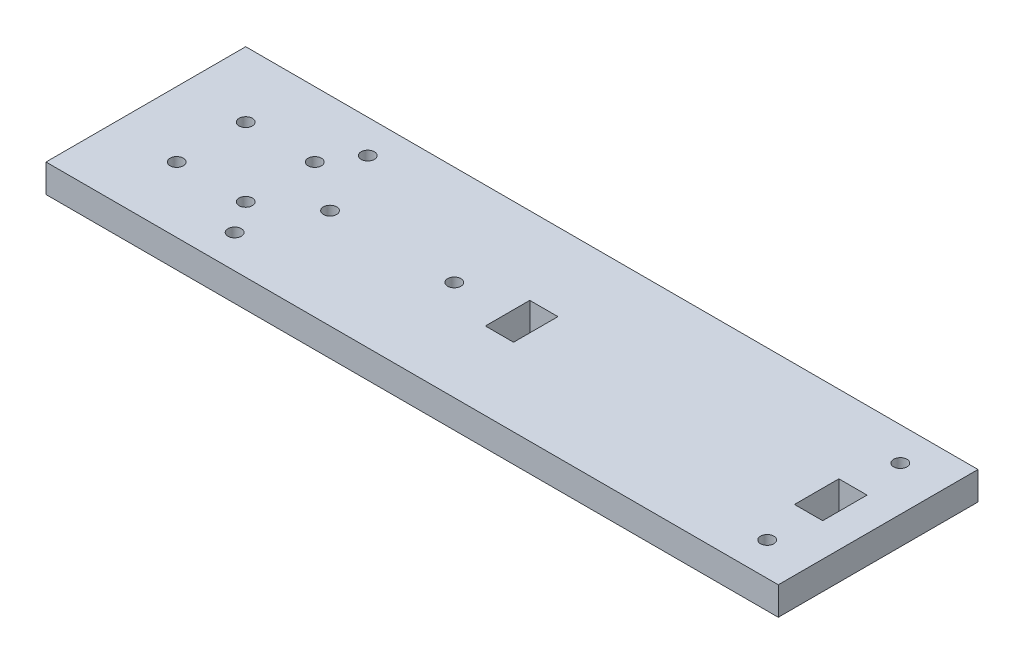
ISO-10303-21;
HEADER;
FILE_DESCRIPTION(('STEP AP214'),'2;1');
FILE_NAME('part.step','',(''),(''),'','','');
FILE_SCHEMA(('AUTOMOTIVE_DESIGN { 1 0 10303 214 1 1 1 1 }'));
ENDSEC;
DATA;
#1=APPLICATION_CONTEXT('core data for automotive mechanical design processes');
#2=APPLICATION_PROTOCOL_DEFINITION('international standard','automotive_design',2000,#1);
#3=PRODUCT_CONTEXT('',#1,'mechanical');
#4=PRODUCT('Part','Part','',(#3));
#5=PRODUCT_RELATED_PRODUCT_CATEGORY('part','',(#4));
#6=PRODUCT_DEFINITION_FORMATION('','',#4);
#7=PRODUCT_DEFINITION_CONTEXT('part definition',#1,'design');
#8=PRODUCT_DEFINITION('design','',#6,#7);
#9=PRODUCT_DEFINITION_SHAPE('','',#8);
#10=(LENGTH_UNIT() NAMED_UNIT(*) SI_UNIT(.MILLI.,.METRE.));
#11=(NAMED_UNIT(*) PLANE_ANGLE_UNIT() SI_UNIT($,.RADIAN.));
#12=(NAMED_UNIT(*) SI_UNIT($,.STERADIAN.) SOLID_ANGLE_UNIT());
#13=UNCERTAINTY_MEASURE_WITH_UNIT(LENGTH_MEASURE(1.E-05),#10,'distance_accuracy_value','');
#14=(GEOMETRIC_REPRESENTATION_CONTEXT(3) GLOBAL_UNCERTAINTY_ASSIGNED_CONTEXT((#13)) GLOBAL_UNIT_ASSIGNED_CONTEXT((#10,
#11,#12)) REPRESENTATION_CONTEXT('',''));
#15=CARTESIAN_POINT('',(0.,0.,0.));
#16=DIRECTION('',(0.,0.,1.));
#17=DIRECTION('',(1.,0.,0.));
#18=AXIS2_PLACEMENT_3D('',#15,#16,#17);
#19=CARTESIAN_POINT('',(81.5,6.35,0.));
#20=DIRECTION('',(1.,0.,0.));
#21=DIRECTION('',(0.,0.,-1.));
#22=AXIS2_PLACEMENT_3D('',#19,#20,#21);
#23=PLANE('',#22);
#24=DIRECTION('',(0.,0.,1.));
#25=VECTOR('',#24,1.);
#26=CARTESIAN_POINT('',(81.5,0.,0.));
#27=LINE('',#26,#25);
#28=CARTESIAN_POINT('',(81.5,0.,-27.5));
#29=VERTEX_POINT('',#28);
#30=CARTESIAN_POINT('',(81.5,0.,-17.5));
#31=VERTEX_POINT('',#30);
#32=EDGE_CURVE('E214',#29,#31,#27,.T.);
#33=ORIENTED_EDGE('',*,*,#32,.F.);
#34=DIRECTION('',(0.,-1.,0.));
#35=VECTOR('',#34,1.);
#36=CARTESIAN_POINT('',(81.5,6.35,-27.5));
#37=LINE('',#36,#35);
#38=CARTESIAN_POINT('',(81.5,6.35,-27.5));
#39=VERTEX_POINT('',#38);
#40=EDGE_CURVE('E11',#39,#29,#37,.T.);
#41=ORIENTED_EDGE('',*,*,#40,.F.);
#42=DIRECTION('',(0.,0.,1.));
#43=VECTOR('',#42,1.);
#44=CARTESIAN_POINT('',(81.5,6.35,0.));
#45=LINE('',#44,#43);
#46=CARTESIAN_POINT('',(81.5,6.35,-17.5));
#47=VERTEX_POINT('',#46);
#48=EDGE_CURVE('E152',#39,#47,#45,.T.);
#49=ORIENTED_EDGE('',*,*,#48,.T.);
#50=DIRECTION('',(0.,-1.,0.));
#51=VECTOR('',#50,1.);
#52=CARTESIAN_POINT('',(81.5,6.35,-17.5));
#53=LINE('',#52,#51);
#54=EDGE_CURVE('E101',#47,#31,#53,.T.);
#55=ORIENTED_EDGE('',*,*,#54,.T.);
#56=EDGE_LOOP('',(#33,#41,#49,#55));
#57=FACE_BOUND('',#56,.T.);
#58=ADVANCED_FACE('F35',(#57),#23,.T.);
#59=CARTESIAN_POINT('',(0.,6.35,-27.5));
#60=DIRECTION('',(0.,0.,1.));
#61=DIRECTION('',(1.,0.,0.));
#62=AXIS2_PLACEMENT_3D('',#59,#60,#61);
#63=PLANE('',#62);
#64=DIRECTION('',(-1.,0.,0.));
#65=VECTOR('',#64,1.);
#66=CARTESIAN_POINT('',(0.,0.,-27.5));
#67=LINE('',#66,#65);
#68=CARTESIAN_POINT('',(87.85,0.,-27.5));
#69=VERTEX_POINT('',#68);
#70=EDGE_CURVE('E142',#69,#29,#67,.T.);
#71=ORIENTED_EDGE('',*,*,#70,.F.);
#72=DIRECTION('',(0.,-1.,0.));
#73=VECTOR('',#72,1.);
#74=CARTESIAN_POINT('',(87.85,6.35,-27.5));
#75=LINE('',#74,#73);
#76=CARTESIAN_POINT('',(87.85,6.35,-27.5));
#77=VERTEX_POINT('',#76);
#78=EDGE_CURVE('E45',#77,#69,#75,.T.);
#79=ORIENTED_EDGE('',*,*,#78,.F.);
#80=DIRECTION('',(-1.,0.,0.));
#81=VECTOR('',#80,1.);
#82=CARTESIAN_POINT('',(0.,6.35,-27.5));
#83=LINE('',#82,#81);
#84=EDGE_CURVE('E140',#77,#39,#83,.T.);
#85=ORIENTED_EDGE('',*,*,#84,.T.);
#86=ORIENTED_EDGE('',*,*,#40,.T.);
#87=EDGE_LOOP('',(#71,#79,#85,#86));
#88=FACE_BOUND('',#87,.T.);
#89=ADVANCED_FACE('F138',(#88),#63,.T.);
#90=CARTESIAN_POINT('',(87.85,6.35,0.));
#91=DIRECTION('',(1.,0.,0.));
#92=DIRECTION('',(0.,0.,-1.));
#93=AXIS2_PLACEMENT_3D('',#90,#91,#92);
#94=PLANE('',#93);
#95=DIRECTION('',(0.,0.,1.));
#96=VECTOR('',#95,1.);
#97=CARTESIAN_POINT('',(87.85,0.,0.));
#98=LINE('',#97,#96);
#99=CARTESIAN_POINT('',(87.85,0.,-17.5));
#100=VERTEX_POINT('',#99);
#101=EDGE_CURVE('E217',#69,#100,#98,.T.);
#102=ORIENTED_EDGE('',*,*,#101,.T.);
#103=DIRECTION('',(0.,-1.,0.));
#104=VECTOR('',#103,1.);
#105=CARTESIAN_POINT('',(87.85,6.35,-17.5));
#106=LINE('',#105,#104);
#107=CARTESIAN_POINT('',(87.85,6.35,-17.5));
#108=VERTEX_POINT('',#107);
#109=EDGE_CURVE('E145',#108,#100,#106,.T.);
#110=ORIENTED_EDGE('',*,*,#109,.F.);
#111=DIRECTION('',(0.,0.,1.));
#112=VECTOR('',#111,1.);
#113=CARTESIAN_POINT('',(87.85,6.35,0.));
#114=LINE('',#113,#112);
#115=EDGE_CURVE('E148',#77,#108,#114,.T.);
#116=ORIENTED_EDGE('',*,*,#115,.F.);
#117=ORIENTED_EDGE('',*,*,#78,.T.);
#118=EDGE_LOOP('',(#102,#110,#116,#117));
#119=FACE_BOUND('',#118,.T.);
#120=ADVANCED_FACE('F149',(#119),#94,.F.);
#121=CARTESIAN_POINT('',(0.,6.35,-27.5000000000001));
#122=DIRECTION('',(0.,0.,-1.));
#123=DIRECTION('',(-1.,0.,0.));
#124=AXIS2_PLACEMENT_3D('',#121,#122,#123);
#125=PLANE('',#124);
#126=DIRECTION('',(1.,0.,0.));
#127=VECTOR('',#126,1.);
#128=CARTESIAN_POINT('',(0.,0.,-27.5000000000001));
#129=LINE('',#128,#127);
#130=CARTESIAN_POINT('',(151.15,0.,-27.5));
#131=VERTEX_POINT('',#130);
#132=CARTESIAN_POINT('',(157.5,0.,-27.5));
#133=VERTEX_POINT('',#132);
#134=EDGE_CURVE('E202',#131,#133,#129,.T.);
#135=ORIENTED_EDGE('',*,*,#134,.T.);
#136=DIRECTION('',(0.,-1.,0.));
#137=VECTOR('',#136,1.);
#138=CARTESIAN_POINT('',(157.5,6.35,-27.5));
#139=LINE('',#138,#137);
#140=CARTESIAN_POINT('',(157.5,6.35,-27.5));
#141=VERTEX_POINT('',#140);
#142=EDGE_CURVE('E222',#141,#133,#139,.T.);
#143=ORIENTED_EDGE('',*,*,#142,.F.);
#144=DIRECTION('',(1.,0.,0.));
#145=VECTOR('',#144,1.);
#146=CARTESIAN_POINT('',(0.,6.35,-27.5000000000001));
#147=LINE('',#146,#145);
#148=CARTESIAN_POINT('',(151.15,6.35,-27.5));
#149=VERTEX_POINT('',#148);
#150=EDGE_CURVE('E555',#149,#141,#147,.T.);
#151=ORIENTED_EDGE('',*,*,#150,.F.);
#152=DIRECTION('',(0.,-1.,0.));
#153=VECTOR('',#152,1.);
#154=CARTESIAN_POINT('',(151.15,6.35,-27.5));
#155=LINE('',#154,#153);
#156=EDGE_CURVE('E224',#149,#131,#155,.T.);
#157=ORIENTED_EDGE('',*,*,#156,.T.);
#158=EDGE_LOOP('',(#135,#143,#151,#157));
#159=FACE_BOUND('',#158,.T.);
#160=ADVANCED_FACE('F282',(#159),#125,.F.);
#161=CARTESIAN_POINT('',(157.5,6.35,0.));
#162=DIRECTION('',(1.,0.,0.));
#163=DIRECTION('',(0.,0.,-1.));
#164=AXIS2_PLACEMENT_3D('',#161,#162,#163);
#165=PLANE('',#164);
#166=DIRECTION('',(0.,0.,1.));
#167=VECTOR('',#166,1.);
#168=CARTESIAN_POINT('',(157.5,0.,0.));
#169=LINE('',#168,#167);
#170=CARTESIAN_POINT('',(157.5,0.,-17.5));
#171=VERTEX_POINT('',#170);
#172=EDGE_CURVE('E205',#133,#171,#169,.T.);
#173=ORIENTED_EDGE('',*,*,#172,.T.);
#174=DIRECTION('',(0.,-1.,0.));
#175=VECTOR('',#174,1.);
#176=CARTESIAN_POINT('',(157.5,6.35,-17.5));
#177=LINE('',#176,#175);
#178=CARTESIAN_POINT('',(157.5,6.35,-17.5));
#179=VERTEX_POINT('',#178);
#180=EDGE_CURVE('E228',#179,#171,#177,.T.);
#181=ORIENTED_EDGE('',*,*,#180,.F.);
#182=DIRECTION('',(0.,0.,1.));
#183=VECTOR('',#182,1.);
#184=CARTESIAN_POINT('',(157.5,6.35,0.));
#185=LINE('',#184,#183);
#186=EDGE_CURVE('E558',#141,#179,#185,.T.);
#187=ORIENTED_EDGE('',*,*,#186,.F.);
#188=ORIENTED_EDGE('',*,*,#142,.T.);
#189=EDGE_LOOP('',(#173,#181,#187,#188));
#190=FACE_BOUND('',#189,.T.);
#191=ADVANCED_FACE('F278',(#190),#165,.F.);
#192=CARTESIAN_POINT('',(0.,6.35,-17.5000000000001));
#193=DIRECTION('',(0.,0.,-1.));
#194=DIRECTION('',(-1.,0.,0.));
#195=AXIS2_PLACEMENT_3D('',#192,#193,#194);
#196=PLANE('',#195);
#197=DIRECTION('',(1.,0.,0.));
#198=VECTOR('',#197,1.);
#199=CARTESIAN_POINT('',(0.,0.,-17.5000000000001));
#200=LINE('',#199,#198);
#201=CARTESIAN_POINT('',(151.15,0.,-17.5));
#202=VERTEX_POINT('',#201);
#203=EDGE_CURVE('E208',#202,#171,#200,.T.);
#204=ORIENTED_EDGE('',*,*,#203,.F.);
#205=DIRECTION('',(0.,-1.,0.));
#206=VECTOR('',#205,1.);
#207=CARTESIAN_POINT('',(151.15,6.35,-17.5));
#208=LINE('',#207,#206);
#209=CARTESIAN_POINT('',(151.15,6.35,-17.5));
#210=VERTEX_POINT('',#209);
#211=EDGE_CURVE('E226',#210,#202,#208,.T.);
#212=ORIENTED_EDGE('',*,*,#211,.F.);
#213=DIRECTION('',(1.,0.,0.));
#214=VECTOR('',#213,1.);
#215=CARTESIAN_POINT('',(0.,6.35,-17.5000000000001));
#216=LINE('',#215,#214);
#217=EDGE_CURVE('E564',#210,#179,#216,.T.);
#218=ORIENTED_EDGE('',*,*,#217,.T.);
#219=ORIENTED_EDGE('',*,*,#180,.T.);
#220=EDGE_LOOP('',(#204,#212,#218,#219));
#221=FACE_BOUND('',#220,.T.);
#222=ADVANCED_FACE('F275',(#221),#196,.T.);
#223=CARTESIAN_POINT('',(0.,6.35,0.));
#224=DIRECTION('',(0.,0.,-1.));
#225=DIRECTION('',(-1.,0.,0.));
#226=AXIS2_PLACEMENT_3D('',#223,#224,#225);
#227=PLANE('',#226);
#228=DIRECTION('',(1.,0.,0.));
#229=VECTOR('',#228,1.);
#230=CARTESIAN_POINT('',(0.,0.,0.));
#231=LINE('',#230,#229);
#232=CARTESIAN_POINT('',(0.,0.,0.));
#233=VERTEX_POINT('',#232);
#234=CARTESIAN_POINT('',(165.,0.,0.));
#235=VERTEX_POINT('',#234);
#236=EDGE_CURVE('E172',#233,#235,#231,.T.);
#237=ORIENTED_EDGE('',*,*,#236,.T.);
#238=DIRECTION('',(0.,-1.,0.));
#239=VECTOR('',#238,1.);
#240=CARTESIAN_POINT('',(165.,6.35,0.));
#241=LINE('',#240,#239);
#242=CARTESIAN_POINT('',(165.,6.35,0.));
#243=VERTEX_POINT('',#242);
#244=EDGE_CURVE('E39',#243,#235,#241,.T.);
#245=ORIENTED_EDGE('',*,*,#244,.F.);
#246=DIRECTION('',(1.,0.,0.));
#247=VECTOR('',#246,1.);
#248=CARTESIAN_POINT('',(0.,6.35,0.));
#249=LINE('',#248,#247);
#250=CARTESIAN_POINT('',(0.,6.35,0.));
#251=VERTEX_POINT('',#250);
#252=EDGE_CURVE('E527',#251,#243,#249,.T.);
#253=ORIENTED_EDGE('',*,*,#252,.F.);
#254=DIRECTION('',(0.,-1.,0.));
#255=VECTOR('',#254,1.);
#256=CARTESIAN_POINT('',(0.,6.35,0.));
#257=LINE('',#256,#255);
#258=EDGE_CURVE('E159',#251,#233,#257,.T.);
#259=ORIENTED_EDGE('',*,*,#258,.T.);
#260=EDGE_LOOP('',(#237,#245,#253,#259));
#261=FACE_BOUND('',#260,.T.);
#262=ADVANCED_FACE('F243',(#261),#227,.F.);
#263=CARTESIAN_POINT('',(165.,6.35,0.));
#264=DIRECTION('',(-1.,0.,0.));
#265=DIRECTION('',(0.,0.,1.));
#266=AXIS2_PLACEMENT_3D('',#263,#264,#265);
#267=PLANE('',#266);
#268=DIRECTION('',(0.,0.,-1.));
#269=VECTOR('',#268,1.);
#270=CARTESIAN_POINT('',(165.,0.,0.));
#271=LINE('',#270,#269);
#272=CARTESIAN_POINT('',(165.,0.,-45.));
#273=VERTEX_POINT('',#272);
#274=EDGE_CURVE('E175',#235,#273,#271,.T.);
#275=ORIENTED_EDGE('',*,*,#274,.T.);
#276=DIRECTION('',(0.,-1.,0.));
#277=VECTOR('',#276,1.);
#278=CARTESIAN_POINT('',(165.,6.35,-45.));
#279=LINE('',#278,#277);
#280=CARTESIAN_POINT('',(165.,6.35,-45.));
#281=VERTEX_POINT('',#280);
#282=EDGE_CURVE('E234',#281,#273,#279,.T.);
#283=ORIENTED_EDGE('',*,*,#282,.F.);
#284=DIRECTION('',(0.,0.,-1.));
#285=VECTOR('',#284,1.);
#286=CARTESIAN_POINT('',(165.,6.35,0.));
#287=LINE('',#286,#285);
#288=EDGE_CURVE('E109',#243,#281,#287,.T.);
#289=ORIENTED_EDGE('',*,*,#288,.F.);
#290=ORIENTED_EDGE('',*,*,#244,.T.);
#291=EDGE_LOOP('',(#275,#283,#289,#290));
#292=FACE_BOUND('',#291,.T.);
#293=ADVANCED_FACE('F239',(#292),#267,.F.);
#294=CARTESIAN_POINT('',(0.,6.35,-45.));
#295=DIRECTION('',(0.,0.,-1.));
#296=DIRECTION('',(-1.,0.,0.));
#297=AXIS2_PLACEMENT_3D('',#294,#295,#296);
#298=PLANE('',#297);
#299=DIRECTION('',(1.,0.,0.));
#300=VECTOR('',#299,1.);
#301=CARTESIAN_POINT('',(0.,0.,-45.));
#302=LINE('',#301,#300);
#303=CARTESIAN_POINT('',(0.,0.,-45.));
#304=VERTEX_POINT('',#303);
#305=EDGE_CURVE('E178',#304,#273,#302,.T.);
#306=ORIENTED_EDGE('',*,*,#305,.F.);
#307=DIRECTION('',(0.,-1.,0.));
#308=VECTOR('',#307,1.);
#309=CARTESIAN_POINT('',(0.,6.35,-45.));
#310=LINE('',#309,#308);
#311=CARTESIAN_POINT('',(0.,6.35,-45.));
#312=VERTEX_POINT('',#311);
#313=EDGE_CURVE('E233',#312,#304,#310,.T.);
#314=ORIENTED_EDGE('',*,*,#313,.F.);
#315=DIRECTION('',(1.,0.,0.));
#316=VECTOR('',#315,1.);
#317=CARTESIAN_POINT('',(0.,6.35,-45.));
#318=LINE('',#317,#316);
#319=EDGE_CURVE('E578',#312,#281,#318,.T.);
#320=ORIENTED_EDGE('',*,*,#319,.T.);
#321=ORIENTED_EDGE('',*,*,#282,.T.);
#322=EDGE_LOOP('',(#306,#314,#320,#321));
#323=FACE_BOUND('',#322,.T.);
#324=ADVANCED_FACE('F254',(#323),#298,.T.);
#325=CARTESIAN_POINT('',(151.15,6.35,0.));
#326=DIRECTION('',(1.,0.,0.));
#327=DIRECTION('',(0.,0.,-1.));
#328=AXIS2_PLACEMENT_3D('',#325,#326,#327);
#329=PLANE('',#328);
#330=DIRECTION('',(0.,0.,1.));
#331=VECTOR('',#330,1.);
#332=CARTESIAN_POINT('',(151.15,0.,0.));
#333=LINE('',#332,#331);
#334=EDGE_CURVE('E211',#131,#202,#333,.T.);
#335=ORIENTED_EDGE('',*,*,#334,.F.);
#336=ORIENTED_EDGE('',*,*,#156,.F.);
#337=DIRECTION('',(0.,0.,1.));
#338=VECTOR('',#337,1.);
#339=CARTESIAN_POINT('',(151.15,6.35,0.));
#340=LINE('',#339,#338);
#341=EDGE_CURVE('E154',#149,#210,#340,.T.);
#342=ORIENTED_EDGE('',*,*,#341,.T.);
#343=ORIENTED_EDGE('',*,*,#211,.T.);
#344=EDGE_LOOP('',(#335,#336,#342,#343));
#345=FACE_BOUND('',#344,.T.);
#346=ADVANCED_FACE('F256',(#345),#329,.T.);
#347=CARTESIAN_POINT('',(155.,6.35,-7.5));
#348=DIRECTION('',(0.,-1.,0.));
#349=DIRECTION('',(0.,0.,-1.));
#350=AXIS2_PLACEMENT_3D('',#347,#348,#349);
#351=CYLINDRICAL_SURFACE('',#350,1.5);
#352=CARTESIAN_POINT('',(155.,6.35,-7.5));
#353=DIRECTION('',(0.,1.,0.));
#354=DIRECTION('',(0.,0.,1.));
#355=AXIS2_PLACEMENT_3D('',#352,#353,#354);
#356=CIRCLE('',#355,1.5);
#357=CARTESIAN_POINT('',(155.,6.35,-6.));
#358=VERTEX_POINT('',#357);
#359=EDGE_CURVE('E551',#358,#358,#356,.T.);
#360=ORIENTED_EDGE('',*,*,#359,.T.);
#361=EDGE_LOOP('',(#360));
#362=FACE_BOUND('',#361,.T.);
#363=CARTESIAN_POINT('',(155.,0.,-7.5));
#364=DIRECTION('',(0.,1.,0.));
#365=DIRECTION('',(0.,0.,1.));
#366=AXIS2_PLACEMENT_3D('',#363,#364,#365);
#367=CIRCLE('',#366,1.5);
#368=CARTESIAN_POINT('',(155.,0.,-6.));
#369=VERTEX_POINT('',#368);
#370=EDGE_CURVE('E199',#369,#369,#367,.T.);
#371=ORIENTED_EDGE('',*,*,#370,.F.);
#372=EDGE_LOOP('',(#371));
#373=FACE_BOUND('',#372,.T.);
#374=ADVANCED_FACE('F262',(#362,#373),#351,.F.);
#375=CARTESIAN_POINT('',(155.,6.35,-37.5));
#376=DIRECTION('',(0.,-1.,0.));
#377=DIRECTION('',(0.,0.,-1.));
#378=AXIS2_PLACEMENT_3D('',#375,#376,#377);
#379=CYLINDRICAL_SURFACE('',#378,1.5);
#380=CARTESIAN_POINT('',(155.,6.35,-37.5));
#381=DIRECTION('',(0.,1.,0.));
#382=DIRECTION('',(0.,0.,1.));
#383=AXIS2_PLACEMENT_3D('',#380,#381,#382);
#384=CIRCLE('',#383,1.5);
#385=CARTESIAN_POINT('',(155.,6.35,-36.));
#386=VERTEX_POINT('',#385);
#387=EDGE_CURVE('E547',#386,#386,#384,.T.);
#388=ORIENTED_EDGE('',*,*,#387,.T.);
#389=EDGE_LOOP('',(#388));
#390=FACE_BOUND('',#389,.T.);
#391=CARTESIAN_POINT('',(155.,0.,-37.5));
#392=DIRECTION('',(0.,1.,0.));
#393=DIRECTION('',(0.,0.,1.));
#394=AXIS2_PLACEMENT_3D('',#391,#392,#393);
#395=CIRCLE('',#394,1.5);
#396=CARTESIAN_POINT('',(155.,0.,-36.));
#397=VERTEX_POINT('',#396);
#398=EDGE_CURVE('E196',#397,#397,#395,.T.);
#399=ORIENTED_EDGE('',*,*,#398,.F.);
#400=EDGE_LOOP('',(#399));
#401=FACE_BOUND('',#400,.T.);
#402=ADVANCED_FACE('F289',(#390,#401),#379,.F.);
#403=CARTESIAN_POINT('',(14.721825406948,6.35,-30.278174593052));
#404=DIRECTION('',(0.,-1.,0.));
#405=DIRECTION('',(0.,0.,-1.));
#406=AXIS2_PLACEMENT_3D('',#403,#404,#405);
#407=CYLINDRICAL_SURFACE('',#406,1.5);
#408=CARTESIAN_POINT('',(14.721825406948,6.35,-30.278174593052));
#409=DIRECTION('',(0.,1.,0.));
#410=DIRECTION('',(0.,0.,1.));
#411=AXIS2_PLACEMENT_3D('',#408,#409,#410);
#412=CIRCLE('',#411,1.5);
#413=CARTESIAN_POINT('',(14.721825406948,6.35,-28.778174593052));
#414=VERTEX_POINT('',#413);
#415=EDGE_CURVE('E543',#414,#414,#412,.T.);
#416=ORIENTED_EDGE('',*,*,#415,.T.);
#417=EDGE_LOOP('',(#416));
#418=FACE_BOUND('',#417,.T.);
#419=CARTESIAN_POINT('',(14.721825406948,0.,-30.278174593052));
#420=DIRECTION('',(0.,1.,0.));
#421=DIRECTION('',(0.,0.,1.));
#422=AXIS2_PLACEMENT_3D('',#419,#420,#421);
#423=CIRCLE('',#422,1.5);
#424=CARTESIAN_POINT('',(14.721825406948,0.,-28.778174593052));
#425=VERTEX_POINT('',#424);
#426=EDGE_CURVE('E193',#425,#425,#423,.T.);
#427=ORIENTED_EDGE('',*,*,#426,.F.);
#428=EDGE_LOOP('',(#427));
#429=FACE_BOUND('',#428,.T.);
#430=ADVANCED_FACE('F293',(#418,#429),#407,.F.);
#431=CARTESIAN_POINT('',(30.278174593052,6.35,-30.278174593052));
#432=DIRECTION('',(0.,-1.,0.));
#433=DIRECTION('',(0.,0.,-1.));
#434=AXIS2_PLACEMENT_3D('',#431,#432,#433);
#435=CYLINDRICAL_SURFACE('',#434,1.5);
#436=CARTESIAN_POINT('',(30.278174593052,6.35,-30.278174593052));
#437=DIRECTION('',(0.,1.,0.));
#438=DIRECTION('',(0.,0.,1.));
#439=AXIS2_PLACEMENT_3D('',#436,#437,#438);
#440=CIRCLE('',#439,1.5);
#441=CARTESIAN_POINT('',(30.278174593052,6.35,-28.778174593052));
#442=VERTEX_POINT('',#441);
#443=EDGE_CURVE('E539',#442,#442,#440,.T.);
#444=ORIENTED_EDGE('',*,*,#443,.T.);
#445=EDGE_LOOP('',(#444));
#446=FACE_BOUND('',#445,.T.);
#447=CARTESIAN_POINT('',(30.278174593052,0.,-30.278174593052));
#448=DIRECTION('',(0.,1.,0.));
#449=DIRECTION('',(0.,0.,1.));
#450=AXIS2_PLACEMENT_3D('',#447,#448,#449);
#451=CIRCLE('',#450,1.5);
#452=CARTESIAN_POINT('',(30.278174593052,0.,-28.778174593052));
#453=VERTEX_POINT('',#452);
#454=EDGE_CURVE('E190',#453,#453,#451,.T.);
#455=ORIENTED_EDGE('',*,*,#454,.F.);
#456=EDGE_LOOP('',(#455));
#457=FACE_BOUND('',#456,.T.);
#458=ADVANCED_FACE('F297',(#446,#457),#435,.F.);
#459=CARTESIAN_POINT('',(14.721825406948,6.35,-14.721825406948));
#460=DIRECTION('',(0.,-1.,0.));
#461=DIRECTION('',(0.,0.,-1.));
#462=AXIS2_PLACEMENT_3D('',#459,#460,#461);
#463=CYLINDRICAL_SURFACE('',#462,1.5);
#464=CARTESIAN_POINT('',(14.721825406948,6.35,-14.721825406948));
#465=DIRECTION('',(0.,1.,0.));
#466=DIRECTION('',(0.,0.,1.));
#467=AXIS2_PLACEMENT_3D('',#464,#465,#466);
#468=CIRCLE('',#467,1.5);
#469=CARTESIAN_POINT('',(14.721825406948,6.35,-13.221825406948));
#470=VERTEX_POINT('',#469);
#471=EDGE_CURVE('E535',#470,#470,#468,.T.);
#472=ORIENTED_EDGE('',*,*,#471,.T.);
#473=EDGE_LOOP('',(#472));
#474=FACE_BOUND('',#473,.T.);
#475=CARTESIAN_POINT('',(14.721825406948,0.,-14.721825406948));
#476=DIRECTION('',(0.,1.,0.));
#477=DIRECTION('',(0.,0.,1.));
#478=AXIS2_PLACEMENT_3D('',#475,#476,#477);
#479=CIRCLE('',#478,1.5);
#480=CARTESIAN_POINT('',(14.721825406948,0.,-13.221825406948));
#481=VERTEX_POINT('',#480);
#482=EDGE_CURVE('E187',#481,#481,#479,.T.);
#483=ORIENTED_EDGE('',*,*,#482,.F.);
#484=EDGE_LOOP('',(#483));
#485=FACE_BOUND('',#484,.T.);
#486=ADVANCED_FACE('F301',(#474,#485),#463,.F.);
#487=CARTESIAN_POINT('',(30.278174593052,6.35,-14.721825406948));
#488=DIRECTION('',(0.,-1.,0.));
#489=DIRECTION('',(0.,0.,-1.));
#490=AXIS2_PLACEMENT_3D('',#487,#488,#489);
#491=CYLINDRICAL_SURFACE('',#490,1.5);
#492=CARTESIAN_POINT('',(30.278174593052,6.35,-14.721825406948));
#493=DIRECTION('',(0.,1.,0.));
#494=DIRECTION('',(0.,0.,1.));
#495=AXIS2_PLACEMENT_3D('',#492,#493,#494);
#496=CIRCLE('',#495,1.5);
#497=CARTESIAN_POINT('',(30.278174593052,6.35,-13.221825406948));
#498=VERTEX_POINT('',#497);
#499=EDGE_CURVE('E531',#498,#498,#496,.T.);
#500=ORIENTED_EDGE('',*,*,#499,.T.);
#501=EDGE_LOOP('',(#500));
#502=FACE_BOUND('',#501,.T.);
#503=CARTESIAN_POINT('',(30.278174593052,0.,-14.721825406948));
#504=DIRECTION('',(0.,1.,0.));
#505=DIRECTION('',(0.,0.,1.));
#506=AXIS2_PLACEMENT_3D('',#503,#504,#505);
#507=CIRCLE('',#506,1.5);
#508=CARTESIAN_POINT('',(30.278174593052,0.,-13.221825406948));
#509=VERTEX_POINT('',#508);
#510=EDGE_CURVE('E184',#509,#509,#507,.T.);
#511=ORIENTED_EDGE('',*,*,#510,.F.);
#512=EDGE_LOOP('',(#511));
#513=FACE_BOUND('',#512,.T.);
#514=ADVANCED_FACE('F305',(#502,#513),#491,.F.);
#515=CARTESIAN_POINT('',(0.,6.35,0.));
#516=DIRECTION('',(-1.,0.,0.));
#517=DIRECTION('',(0.,0.,1.));
#518=AXIS2_PLACEMENT_3D('',#515,#516,#517);
#519=PLANE('',#518);
#520=DIRECTION('',(0.,0.,-1.));
#521=VECTOR('',#520,1.);
#522=CARTESIAN_POINT('',(0.,0.,0.));
#523=LINE('',#522,#521);
#524=EDGE_CURVE('E181',#233,#304,#523,.T.);
#525=ORIENTED_EDGE('',*,*,#524,.F.);
#526=ORIENTED_EDGE('',*,*,#258,.F.);
#527=DIRECTION('',(0.,0.,-1.));
#528=VECTOR('',#527,1.);
#529=CARTESIAN_POINT('',(0.,6.35,0.));
#530=LINE('',#529,#528);
#531=EDGE_CURVE('E252',#251,#312,#530,.T.);
#532=ORIENTED_EDGE('',*,*,#531,.T.);
#533=ORIENTED_EDGE('',*,*,#313,.T.);
#534=EDGE_LOOP('',(#525,#526,#532,#533));
#535=FACE_BOUND('',#534,.T.);
#536=ADVANCED_FACE('F249',(#535),#519,.T.);
#537=CARTESIAN_POINT('',(35.,6.35,-37.5));
#538=DIRECTION('',(0.,-1.,0.));
#539=DIRECTION('',(0.,0.,-1.));
#540=AXIS2_PLACEMENT_3D('',#537,#538,#539);
#541=CYLINDRICAL_SURFACE('',#540,1.5);
#542=CARTESIAN_POINT('',(35.,6.35,-37.5));
#543=DIRECTION('',(0.,1.,0.));
#544=DIRECTION('',(0.,0.,1.));
#545=AXIS2_PLACEMENT_3D('',#542,#543,#544);
#546=CIRCLE('',#545,1.5);
#547=CARTESIAN_POINT('',(35.,6.35,-36.));
#548=VERTEX_POINT('',#547);
#549=EDGE_CURVE('E525',#548,#548,#546,.T.);
#550=ORIENTED_EDGE('',*,*,#549,.T.);
#551=EDGE_LOOP('',(#550));
#552=FACE_BOUND('',#551,.T.);
#553=CARTESIAN_POINT('',(35.,0.,-37.5));
#554=DIRECTION('',(0.,1.,0.));
#555=DIRECTION('',(0.,0.,1.));
#556=AXIS2_PLACEMENT_3D('',#553,#554,#555);
#557=CIRCLE('',#556,1.5);
#558=CARTESIAN_POINT('',(35.,0.,-36.));
#559=VERTEX_POINT('',#558);
#560=EDGE_CURVE('E169',#559,#559,#557,.T.);
#561=ORIENTED_EDGE('',*,*,#560,.F.);
#562=EDGE_LOOP('',(#561));
#563=FACE_BOUND('',#562,.T.);
#564=ADVANCED_FACE('F310',(#552,#563),#541,.F.);
#565=CARTESIAN_POINT('',(35.,6.35,-7.5));
#566=DIRECTION('',(0.,-1.,0.));
#567=DIRECTION('',(0.,0.,-1.));
#568=AXIS2_PLACEMENT_3D('',#565,#566,#567);
#569=CYLINDRICAL_SURFACE('',#568,1.5);
#570=CARTESIAN_POINT('',(35.,6.35,-7.5));
#571=DIRECTION('',(0.,1.,0.));
#572=DIRECTION('',(0.,0.,1.));
#573=AXIS2_PLACEMENT_3D('',#570,#571,#572);
#574=CIRCLE('',#573,1.5);
#575=CARTESIAN_POINT('',(35.,6.35,-6.));
#576=VERTEX_POINT('',#575);
#577=EDGE_CURVE('E522',#576,#576,#574,.T.);
#578=ORIENTED_EDGE('',*,*,#577,.T.);
#579=EDGE_LOOP('',(#578));
#580=FACE_BOUND('',#579,.T.);
#581=CARTESIAN_POINT('',(35.,0.,-7.5));
#582=DIRECTION('',(0.,1.,0.));
#583=DIRECTION('',(0.,0.,1.));
#584=AXIS2_PLACEMENT_3D('',#581,#582,#583);
#585=CIRCLE('',#584,1.5);
#586=CARTESIAN_POINT('',(35.,0.,-6.));
#587=VERTEX_POINT('',#586);
#588=EDGE_CURVE('E166',#587,#587,#585,.T.);
#589=ORIENTED_EDGE('',*,*,#588,.F.);
#590=EDGE_LOOP('',(#589));
#591=FACE_BOUND('',#590,.T.);
#592=ADVANCED_FACE('F314',(#580,#591),#569,.F.);
#593=CARTESIAN_POINT('',(41.5,6.35,-22.5));
#594=DIRECTION('',(0.,-1.,0.));
#595=DIRECTION('',(0.,0.,-1.));
#596=AXIS2_PLACEMENT_3D('',#593,#594,#595);
#597=CYLINDRICAL_SURFACE('',#596,1.5);
#598=CARTESIAN_POINT('',(41.5,6.35,-22.5));
#599=DIRECTION('',(0.,1.,0.));
#600=DIRECTION('',(0.,0.,1.));
#601=AXIS2_PLACEMENT_3D('',#598,#599,#600);
#602=CIRCLE('',#601,1.5);
#603=CARTESIAN_POINT('',(41.5,6.35,-21.));
#604=VERTEX_POINT('',#603);
#605=EDGE_CURVE('E336',#604,#604,#602,.T.);
#606=ORIENTED_EDGE('',*,*,#605,.T.);
#607=EDGE_LOOP('',(#606));
#608=FACE_BOUND('',#607,.T.);
#609=CARTESIAN_POINT('',(41.5,0.,-22.5));
#610=DIRECTION('',(0.,1.,0.));
#611=DIRECTION('',(0.,0.,1.));
#612=AXIS2_PLACEMENT_3D('',#609,#610,#611);
#613=CIRCLE('',#612,1.5);
#614=CARTESIAN_POINT('',(41.5,0.,-21.));
#615=VERTEX_POINT('',#614);
#616=EDGE_CURVE('E163',#615,#615,#613,.T.);
#617=ORIENTED_EDGE('',*,*,#616,.F.);
#618=EDGE_LOOP('',(#617));
#619=FACE_BOUND('',#618,.T.);
#620=ADVANCED_FACE('F320',(#608,#619),#597,.F.);
#621=CARTESIAN_POINT('',(69.5,6.35,-22.5));
#622=DIRECTION('',(0.,-1.,0.));
#623=DIRECTION('',(0.,0.,-1.));
#624=AXIS2_PLACEMENT_3D('',#621,#622,#623);
#625=CYLINDRICAL_SURFACE('',#624,1.5);
#626=CARTESIAN_POINT('',(69.5,6.35,-22.5));
#627=DIRECTION('',(0.,1.,0.));
#628=DIRECTION('',(0.,0.,1.));
#629=AXIS2_PLACEMENT_3D('',#626,#627,#628);
#630=CIRCLE('',#629,1.5);
#631=CARTESIAN_POINT('',(69.5,6.35,-21.));
#632=VERTEX_POINT('',#631);
#633=EDGE_CURVE('E220',#632,#632,#630,.T.);
#634=ORIENTED_EDGE('',*,*,#633,.T.);
#635=EDGE_LOOP('',(#634));
#636=FACE_BOUND('',#635,.T.);
#637=CARTESIAN_POINT('',(69.5,0.,-22.5));
#638=DIRECTION('',(0.,1.,0.));
#639=DIRECTION('',(0.,0.,1.));
#640=AXIS2_PLACEMENT_3D('',#637,#638,#639);
#641=CIRCLE('',#640,1.5);
#642=CARTESIAN_POINT('',(69.5,0.,-21.));
#643=VERTEX_POINT('',#642);
#644=EDGE_CURVE('E160',#643,#643,#641,.T.);
#645=ORIENTED_EDGE('',*,*,#644,.F.);
#646=EDGE_LOOP('',(#645));
#647=FACE_BOUND('',#646,.T.);
#648=ADVANCED_FACE('F37',(#636,#647),#625,.F.);
#649=CARTESIAN_POINT('',(0.,6.35,-17.5));
#650=DIRECTION('',(0.,0.,1.));
#651=DIRECTION('',(1.,0.,0.));
#652=AXIS2_PLACEMENT_3D('',#649,#650,#651);
#653=PLANE('',#652);
#654=DIRECTION('',(-1.,0.,0.));
#655=VECTOR('',#654,1.);
#656=CARTESIAN_POINT('',(0.,0.,-17.5));
#657=LINE('',#656,#655);
#658=EDGE_CURVE('E94',#100,#31,#657,.T.);
#659=ORIENTED_EDGE('',*,*,#658,.T.);
#660=ORIENTED_EDGE('',*,*,#54,.F.);
#661=DIRECTION('',(-1.,0.,0.));
#662=VECTOR('',#661,1.);
#663=CARTESIAN_POINT('',(0.,6.35,-17.5));
#664=LINE('',#663,#662);
#665=EDGE_CURVE('E54',#108,#47,#664,.T.);
#666=ORIENTED_EDGE('',*,*,#665,.F.);
#667=ORIENTED_EDGE('',*,*,#109,.T.);
#668=EDGE_LOOP('',(#659,#660,#666,#667));
#669=FACE_BOUND('',#668,.T.);
#670=ADVANCED_FACE('F331',(#669),#653,.F.);
#671=CARTESIAN_POINT('',(0.,6.35,0.));
#672=DIRECTION('',(0.,1.,0.));
#673=DIRECTION('',(0.,0.,1.));
#674=AXIS2_PLACEMENT_3D('',#671,#672,#673);
#675=PLANE('',#674);
#676=ORIENTED_EDGE('',*,*,#633,.F.);
#677=EDGE_LOOP('',(#676));
#678=FACE_BOUND('',#677,.T.);
#679=ORIENTED_EDGE('',*,*,#605,.F.);
#680=EDGE_LOOP('',(#679));
#681=FACE_BOUND('',#680,.T.);
#682=ORIENTED_EDGE('',*,*,#577,.F.);
#683=EDGE_LOOP('',(#682));
#684=FACE_BOUND('',#683,.T.);
#685=ORIENTED_EDGE('',*,*,#549,.F.);
#686=EDGE_LOOP('',(#685));
#687=FACE_BOUND('',#686,.T.);
#688=ORIENTED_EDGE('',*,*,#252,.T.);
#689=ORIENTED_EDGE('',*,*,#288,.T.);
#690=ORIENTED_EDGE('',*,*,#319,.F.);
#691=ORIENTED_EDGE('',*,*,#531,.F.);
#692=EDGE_LOOP('',(#688,#689,#690,#691));
#693=FACE_BOUND('',#692,.T.);
#694=ORIENTED_EDGE('',*,*,#499,.F.);
#695=EDGE_LOOP('',(#694));
#696=FACE_BOUND('',#695,.T.);
#697=ORIENTED_EDGE('',*,*,#471,.F.);
#698=EDGE_LOOP('',(#697));
#699=FACE_BOUND('',#698,.T.);
#700=ORIENTED_EDGE('',*,*,#443,.F.);
#701=EDGE_LOOP('',(#700));
#702=FACE_BOUND('',#701,.T.);
#703=ORIENTED_EDGE('',*,*,#415,.F.);
#704=EDGE_LOOP('',(#703));
#705=FACE_BOUND('',#704,.T.);
#706=ORIENTED_EDGE('',*,*,#387,.F.);
#707=EDGE_LOOP('',(#706));
#708=FACE_BOUND('',#707,.T.);
#709=ORIENTED_EDGE('',*,*,#359,.F.);
#710=EDGE_LOOP('',(#709));
#711=FACE_BOUND('',#710,.T.);
#712=ORIENTED_EDGE('',*,*,#150,.T.);
#713=ORIENTED_EDGE('',*,*,#186,.T.);
#714=ORIENTED_EDGE('',*,*,#217,.F.);
#715=ORIENTED_EDGE('',*,*,#341,.F.);
#716=EDGE_LOOP('',(#712,#713,#714,#715));
#717=FACE_BOUND('',#716,.T.);
#718=ORIENTED_EDGE('',*,*,#48,.F.);
#719=ORIENTED_EDGE('',*,*,#84,.F.);
#720=ORIENTED_EDGE('',*,*,#115,.T.);
#721=ORIENTED_EDGE('',*,*,#665,.T.);
#722=EDGE_LOOP('',(#718,#719,#720,#721));
#723=FACE_BOUND('',#722,.T.);
#724=ADVANCED_FACE('F151',(#678,#681,#684,#687,#693,#696,#699,#702,#705,#708,#711,#717,#723),
#675,.T.);
#725=CARTESIAN_POINT('',(0.,0.,0.));
#726=DIRECTION('',(0.,1.,0.));
#727=DIRECTION('',(0.,0.,1.));
#728=AXIS2_PLACEMENT_3D('',#725,#726,#727);
#729=PLANE('',#728);
#730=ORIENTED_EDGE('',*,*,#644,.T.);
#731=EDGE_LOOP('',(#730));
#732=FACE_BOUND('',#731,.T.);
#733=ORIENTED_EDGE('',*,*,#616,.T.);
#734=EDGE_LOOP('',(#733));
#735=FACE_BOUND('',#734,.T.);
#736=ORIENTED_EDGE('',*,*,#588,.T.);
#737=EDGE_LOOP('',(#736));
#738=FACE_BOUND('',#737,.T.);
#739=ORIENTED_EDGE('',*,*,#560,.T.);
#740=EDGE_LOOP('',(#739));
#741=FACE_BOUND('',#740,.T.);
#742=ORIENTED_EDGE('',*,*,#236,.F.);
#743=ORIENTED_EDGE('',*,*,#524,.T.);
#744=ORIENTED_EDGE('',*,*,#305,.T.);
#745=ORIENTED_EDGE('',*,*,#274,.F.);
#746=EDGE_LOOP('',(#742,#743,#744,#745));
#747=FACE_BOUND('',#746,.T.);
#748=ORIENTED_EDGE('',*,*,#510,.T.);
#749=EDGE_LOOP('',(#748));
#750=FACE_BOUND('',#749,.T.);
#751=ORIENTED_EDGE('',*,*,#482,.T.);
#752=EDGE_LOOP('',(#751));
#753=FACE_BOUND('',#752,.T.);
#754=ORIENTED_EDGE('',*,*,#454,.T.);
#755=EDGE_LOOP('',(#754));
#756=FACE_BOUND('',#755,.T.);
#757=ORIENTED_EDGE('',*,*,#426,.T.);
#758=EDGE_LOOP('',(#757));
#759=FACE_BOUND('',#758,.T.);
#760=ORIENTED_EDGE('',*,*,#398,.T.);
#761=EDGE_LOOP('',(#760));
#762=FACE_BOUND('',#761,.T.);
#763=ORIENTED_EDGE('',*,*,#370,.T.);
#764=EDGE_LOOP('',(#763));
#765=FACE_BOUND('',#764,.T.);
#766=ORIENTED_EDGE('',*,*,#134,.F.);
#767=ORIENTED_EDGE('',*,*,#334,.T.);
#768=ORIENTED_EDGE('',*,*,#203,.T.);
#769=ORIENTED_EDGE('',*,*,#172,.F.);
#770=EDGE_LOOP('',(#766,#767,#768,#769));
#771=FACE_BOUND('',#770,.T.);
#772=ORIENTED_EDGE('',*,*,#32,.T.);
#773=ORIENTED_EDGE('',*,*,#658,.F.);
#774=ORIENTED_EDGE('',*,*,#101,.F.);
#775=ORIENTED_EDGE('',*,*,#70,.T.);
#776=EDGE_LOOP('',(#772,#773,#774,#775));
#777=FACE_BOUND('',#776,.T.);
#778=ADVANCED_FACE('F246',(#732,#735,#738,#741,#747,#750,#753,#756,#759,#762,#765,#771,#777),
#729,.F.);
#779=CLOSED_SHELL('',(#58,#89,#120,#160,#191,#222,#262,#293,#324,#346,#374,#402,#430,#458,#486,
#514,#536,#564,#592,#620,#648,#670,#724,#778));
#780=MANIFOLD_SOLID_BREP('B2',#779);
#781=ADVANCED_BREP_SHAPE_REPRESENTATION('',(#18,#780),#14);
#782=SHAPE_DEFINITION_REPRESENTATION(#9,#781);
ENDSEC;
END-ISO-10303-21;
